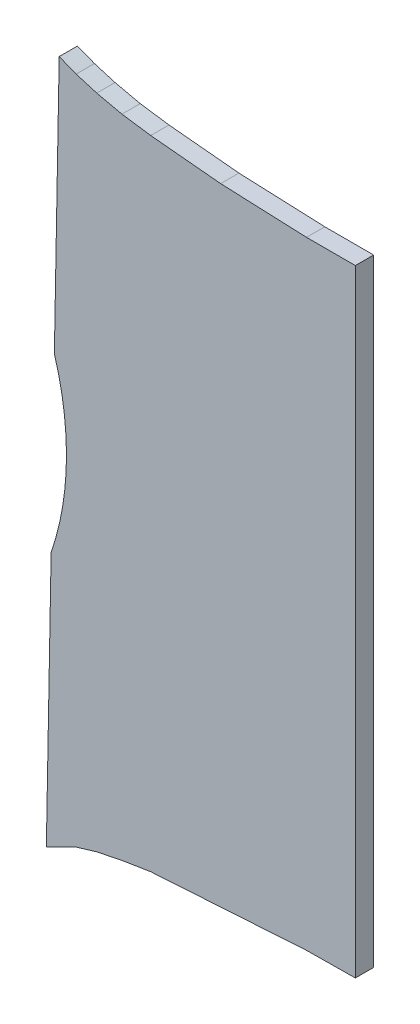
ISO-10303-21;
HEADER;
FILE_DESCRIPTION(('STEP AP214'),'2;1');
FILE_NAME('part.step','',(''),(''),'','','');
FILE_SCHEMA(('AUTOMOTIVE_DESIGN { 1 0 10303 214 1 1 1 1 }'));
ENDSEC;
DATA;
#1=APPLICATION_CONTEXT('core data for automotive mechanical design processes');
#2=APPLICATION_PROTOCOL_DEFINITION('international standard','automotive_design',2000,#1);
#3=PRODUCT_CONTEXT('',#1,'mechanical');
#4=PRODUCT('Part','Part','',(#3));
#5=PRODUCT_RELATED_PRODUCT_CATEGORY('part','',(#4));
#6=PRODUCT_DEFINITION_FORMATION('','',#4);
#7=PRODUCT_DEFINITION_CONTEXT('part definition',#1,'design');
#8=PRODUCT_DEFINITION('design','',#6,#7);
#9=PRODUCT_DEFINITION_SHAPE('','',#8);
#10=(LENGTH_UNIT() NAMED_UNIT(*) SI_UNIT(.MILLI.,.METRE.));
#11=(NAMED_UNIT(*) PLANE_ANGLE_UNIT() SI_UNIT($,.RADIAN.));
#12=(NAMED_UNIT(*) SI_UNIT($,.STERADIAN.) SOLID_ANGLE_UNIT());
#13=UNCERTAINTY_MEASURE_WITH_UNIT(LENGTH_MEASURE(1.E-05),#10,'distance_accuracy_value','');
#14=(GEOMETRIC_REPRESENTATION_CONTEXT(3) GLOBAL_UNCERTAINTY_ASSIGNED_CONTEXT((#13)) GLOBAL_UNIT_ASSIGNED_CONTEXT((#10,
#11,#12)) REPRESENTATION_CONTEXT('',''));
#15=CARTESIAN_POINT('',(0.,0.,0.));
#16=DIRECTION('',(0.,0.,1.));
#17=DIRECTION('',(1.,0.,0.));
#18=AXIS2_PLACEMENT_3D('',#15,#16,#17);
#19=CARTESIAN_POINT('',(97.8160018920898,56.6370010375977,0.));
#20=DIRECTION('',(-1.,0.,0.));
#21=DIRECTION('',(0.,1.,0.));
#22=AXIS2_PLACEMENT_3D('',#19,#20,#21);
#23=PLANE('',#22);
#24=DIRECTION('',(0.,1.,0.));
#25=VECTOR('',#24,1.);
#26=CARTESIAN_POINT('',(97.8160018920898,56.6370010375976,0.03556));
#27=LINE('',#26,#25);
#28=CARTESIAN_POINT('',(97.8160018920898,56.6370010375976,0.03556));
#29=VERTEX_POINT('',#28);
#30=CARTESIAN_POINT('',(97.8160018920898,57.8370018005371,0.03556));
#31=VERTEX_POINT('',#30);
#32=EDGE_CURVE('E11',#29,#31,#27,.T.);
#33=ORIENTED_EDGE('',*,*,#32,.F.);
#34=DIRECTION('',(0.,0.,1.));
#35=VECTOR('',#34,1.);
#36=CARTESIAN_POINT('',(97.8160018920898,56.6370010375976,0.));
#37=LINE('',#36,#35);
#38=CARTESIAN_POINT('',(97.8160018920898,56.6370010375976,0.));
#39=VERTEX_POINT('',#38);
#40=EDGE_CURVE('E24',#39,#29,#37,.T.);
#41=ORIENTED_EDGE('',*,*,#40,.F.);
#42=DIRECTION('',(0.,1.,0.));
#43=VECTOR('',#42,1.);
#44=CARTESIAN_POINT('',(97.8160018920898,56.6370010375976,0.));
#45=LINE('',#44,#43);
#46=CARTESIAN_POINT('',(97.8160018920898,57.8370018005371,0.));
#47=VERTEX_POINT('',#46);
#48=EDGE_CURVE('E281',#39,#47,#45,.T.);
#49=ORIENTED_EDGE('',*,*,#48,.T.);
#50=DIRECTION('',(0.,0.,1.));
#51=VECTOR('',#50,1.);
#52=CARTESIAN_POINT('',(97.8160018920898,57.8370018005371,0.));
#53=LINE('',#52,#51);
#54=EDGE_CURVE('E37',#47,#31,#53,.T.);
#55=ORIENTED_EDGE('',*,*,#54,.T.);
#56=EDGE_LOOP('',(#33,#41,#49,#55));
#57=FACE_BOUND('',#56,.T.);
#58=ADVANCED_FACE('F17',(#57),#23,.F.);
#59=CARTESIAN_POINT('',(97.7210006713867,56.6360015869141,0.));
#60=DIRECTION('',(-0.010519816185477,0.999944665202742,0.));
#61=DIRECTION('',(0.999944665202742,0.010519816185477,0.));
#62=AXIS2_PLACEMENT_3D('',#59,#60,#61);
#63=PLANE('',#62);
#64=DIRECTION('',(0.999944665202742,0.010519816185477,0.));
#65=VECTOR('',#64,1.);
#66=CARTESIAN_POINT('',(97.7210006713867,56.6360015869141,0.03556));
#67=LINE('',#66,#65);
#68=CARTESIAN_POINT('',(97.7210006713867,56.6360015869141,0.03556));
#69=VERTEX_POINT('',#68);
#70=EDGE_CURVE('E277',#69,#29,#67,.T.);
#71=ORIENTED_EDGE('',*,*,#70,.F.);
#72=DIRECTION('',(0.,0.,1.));
#73=VECTOR('',#72,1.);
#74=CARTESIAN_POINT('',(97.7210006713867,56.6360015869141,0.));
#75=LINE('',#74,#73);
#76=CARTESIAN_POINT('',(97.7210006713867,56.6360015869141,0.));
#77=VERTEX_POINT('',#76);
#78=EDGE_CURVE('E275',#77,#69,#75,.T.);
#79=ORIENTED_EDGE('',*,*,#78,.F.);
#80=DIRECTION('',(0.999944665202742,0.010519816185477,0.));
#81=VECTOR('',#80,1.);
#82=CARTESIAN_POINT('',(97.7210006713867,56.6360015869141,0.));
#83=LINE('',#82,#81);
#84=EDGE_CURVE('E273',#77,#39,#83,.T.);
#85=ORIENTED_EDGE('',*,*,#84,.T.);
#86=ORIENTED_EDGE('',*,*,#40,.T.);
#87=EDGE_LOOP('',(#71,#79,#85,#86));
#88=FACE_BOUND('',#87,.T.);
#89=ADVANCED_FACE('F284',(#88),#63,.F.);
#90=CARTESIAN_POINT('',(97.4179992675781,56.617000579834,0.));
#91=DIRECTION('',(-0.0625863654447241,0.998039551751542,0.));
#92=DIRECTION('',(0.998039551751542,0.0625863654447241,0.));
#93=AXIS2_PLACEMENT_3D('',#90,#91,#92);
#94=PLANE('',#93);
#95=DIRECTION('',(0.998039551751542,0.062586365444724,0.));
#96=VECTOR('',#95,1.);
#97=CARTESIAN_POINT('',(97.4179992675781,56.617000579834,0.03556));
#98=LINE('',#97,#96);
#99=CARTESIAN_POINT('',(97.4179992675781,56.617000579834,0.03556));
#100=VERTEX_POINT('',#99);
#101=EDGE_CURVE('E270',#100,#69,#98,.T.);
#102=ORIENTED_EDGE('',*,*,#101,.F.);
#103=DIRECTION('',(0.,0.,1.));
#104=VECTOR('',#103,1.);
#105=CARTESIAN_POINT('',(97.4179992675781,56.617000579834,0.));
#106=LINE('',#105,#104);
#107=CARTESIAN_POINT('',(97.4179992675781,56.617000579834,0.));
#108=VERTEX_POINT('',#107);
#109=EDGE_CURVE('E268',#108,#100,#106,.T.);
#110=ORIENTED_EDGE('',*,*,#109,.F.);
#111=DIRECTION('',(0.998039551751542,0.062586365444724,0.));
#112=VECTOR('',#111,1.);
#113=CARTESIAN_POINT('',(97.4179992675781,56.617000579834,0.));
#114=LINE('',#113,#112);
#115=EDGE_CURVE('E265',#108,#77,#114,.T.);
#116=ORIENTED_EDGE('',*,*,#115,.T.);
#117=ORIENTED_EDGE('',*,*,#78,.T.);
#118=EDGE_LOOP('',(#102,#110,#116,#117));
#119=FACE_BOUND('',#118,.T.);
#120=ADVANCED_FACE('F287',(#119),#94,.F.);
#121=CARTESIAN_POINT('',(97.3619995117188,56.6080017089844,0.));
#122=DIRECTION('',(-0.158659362899509,0.98733338167223,0.));
#123=DIRECTION('',(0.98733338167223,0.158659362899509,0.));
#124=AXIS2_PLACEMENT_3D('',#121,#122,#123);
#125=PLANE('',#124);
#126=DIRECTION('',(0.98733338167223,0.158659362899509,0.));
#127=VECTOR('',#126,1.);
#128=CARTESIAN_POINT('',(97.3619995117188,56.6080017089844,0.03556));
#129=LINE('',#128,#127);
#130=CARTESIAN_POINT('',(97.3619995117188,56.6080017089844,0.03556));
#131=VERTEX_POINT('',#130);
#132=EDGE_CURVE('E262',#131,#100,#129,.T.);
#133=ORIENTED_EDGE('',*,*,#132,.F.);
#134=DIRECTION('',(0.,0.,1.));
#135=VECTOR('',#134,1.);
#136=CARTESIAN_POINT('',(97.3619995117188,56.6080017089844,0.));
#137=LINE('',#136,#135);
#138=CARTESIAN_POINT('',(97.3619995117188,56.6080017089844,0.));
#139=VERTEX_POINT('',#138);
#140=EDGE_CURVE('E260',#139,#131,#137,.T.);
#141=ORIENTED_EDGE('',*,*,#140,.F.);
#142=DIRECTION('',(0.98733338167223,0.158659362899509,0.));
#143=VECTOR('',#142,1.);
#144=CARTESIAN_POINT('',(97.3619995117188,56.6080017089844,0.));
#145=LINE('',#144,#143);
#146=EDGE_CURVE('E257',#139,#108,#145,.T.);
#147=ORIENTED_EDGE('',*,*,#146,.T.);
#148=ORIENTED_EDGE('',*,*,#109,.T.);
#149=EDGE_LOOP('',(#133,#141,#147,#148));
#150=FACE_BOUND('',#149,.T.);
#151=ADVANCED_FACE('F292',(#150),#125,.F.);
#152=CARTESIAN_POINT('',(97.313003540039,56.5979995727539,0.));
#153=DIRECTION('',(-0.200016805310508,0.979792466593502,0.));
#154=DIRECTION('',(0.979792466593502,0.200016805310508,0.));
#155=AXIS2_PLACEMENT_3D('',#152,#153,#154);
#156=PLANE('',#155);
#157=DIRECTION('',(0.979792466593502,0.200016805310508,0.));
#158=VECTOR('',#157,1.);
#159=CARTESIAN_POINT('',(97.313003540039,56.5979995727539,0.03556));
#160=LINE('',#159,#158);
#161=CARTESIAN_POINT('',(97.313003540039,56.5979995727539,0.03556));
#162=VERTEX_POINT('',#161);
#163=EDGE_CURVE('E254',#162,#131,#160,.T.);
#164=ORIENTED_EDGE('',*,*,#163,.F.);
#165=DIRECTION('',(0.,0.,1.));
#166=VECTOR('',#165,1.);
#167=CARTESIAN_POINT('',(97.313003540039,56.5979995727539,0.));
#168=LINE('',#167,#166);
#169=CARTESIAN_POINT('',(97.313003540039,56.5979995727539,0.));
#170=VERTEX_POINT('',#169);
#171=EDGE_CURVE('E252',#170,#162,#168,.T.);
#172=ORIENTED_EDGE('',*,*,#171,.F.);
#173=DIRECTION('',(0.979792466593502,0.200016805310508,0.));
#174=VECTOR('',#173,1.);
#175=CARTESIAN_POINT('',(97.313003540039,56.5979995727539,0.));
#176=LINE('',#175,#174);
#177=EDGE_CURVE('E249',#170,#139,#176,.T.);
#178=ORIENTED_EDGE('',*,*,#177,.T.);
#179=ORIENTED_EDGE('',*,*,#140,.T.);
#180=EDGE_LOOP('',(#164,#172,#178,#179));
#181=FACE_BOUND('',#180,.T.);
#182=ADVANCED_FACE('F295',(#181),#156,.F.);
#183=CARTESIAN_POINT('',(97.2730026245117,56.5859985351562,0.));
#184=DIRECTION('',(-0.287364645680626,0.957821257027034,0.));
#185=DIRECTION('',(0.957821257027034,0.287364645680626,0.));
#186=AXIS2_PLACEMENT_3D('',#183,#184,#185);
#187=PLANE('',#186);
#188=DIRECTION('',(0.957821257027034,0.287364645680626,0.));
#189=VECTOR('',#188,1.);
#190=CARTESIAN_POINT('',(97.2730026245117,56.5859985351562,0.03556));
#191=LINE('',#190,#189);
#192=CARTESIAN_POINT('',(97.2730026245117,56.5859985351562,0.03556));
#193=VERTEX_POINT('',#192);
#194=EDGE_CURVE('E246',#193,#162,#191,.T.);
#195=ORIENTED_EDGE('',*,*,#194,.F.);
#196=DIRECTION('',(0.,0.,1.));
#197=VECTOR('',#196,1.);
#198=CARTESIAN_POINT('',(97.2730026245117,56.5859985351562,0.));
#199=LINE('',#198,#197);
#200=CARTESIAN_POINT('',(97.2730026245117,56.5859985351562,0.));
#201=VERTEX_POINT('',#200);
#202=EDGE_CURVE('E244',#201,#193,#199,.T.);
#203=ORIENTED_EDGE('',*,*,#202,.F.);
#204=DIRECTION('',(0.957821257027034,0.287364645680626,0.));
#205=VECTOR('',#204,1.);
#206=CARTESIAN_POINT('',(97.2730026245117,56.5859985351562,0.));
#207=LINE('',#206,#205);
#208=EDGE_CURVE('E241',#201,#170,#207,.T.);
#209=ORIENTED_EDGE('',*,*,#208,.T.);
#210=ORIENTED_EDGE('',*,*,#171,.T.);
#211=EDGE_LOOP('',(#195,#203,#209,#210));
#212=FACE_BOUND('',#211,.T.);
#213=ADVANCED_FACE('F300',(#212),#187,.F.);
#214=CARTESIAN_POINT('',(97.2149963378906,56.556999206543,0.));
#215=DIRECTION('',(-0.44716653710283,0.894450718651097,0.));
#216=DIRECTION('',(0.894450718651097,0.44716653710283,0.));
#217=AXIS2_PLACEMENT_3D('',#214,#215,#216);
#218=PLANE('',#217);
#219=DIRECTION('',(0.894450718651097,0.44716653710283,0.));
#220=VECTOR('',#219,1.);
#221=CARTESIAN_POINT('',(97.2149963378906,56.556999206543,0.03556));
#222=LINE('',#221,#220);
#223=CARTESIAN_POINT('',(97.2149963378906,56.556999206543,0.03556));
#224=VERTEX_POINT('',#223);
#225=EDGE_CURVE('E238',#224,#193,#222,.T.);
#226=ORIENTED_EDGE('',*,*,#225,.F.);
#227=DIRECTION('',(0.,0.,1.));
#228=VECTOR('',#227,1.);
#229=CARTESIAN_POINT('',(97.2149963378906,56.556999206543,0.));
#230=LINE('',#229,#228);
#231=CARTESIAN_POINT('',(97.2149963378906,56.556999206543,0.));
#232=VERTEX_POINT('',#231);
#233=EDGE_CURVE('E236',#232,#224,#230,.T.);
#234=ORIENTED_EDGE('',*,*,#233,.F.);
#235=DIRECTION('',(0.894450718651097,0.44716653710283,0.));
#236=VECTOR('',#235,1.);
#237=CARTESIAN_POINT('',(97.2149963378906,56.556999206543,0.));
#238=LINE('',#237,#236);
#239=EDGE_CURVE('E233',#232,#201,#238,.T.);
#240=ORIENTED_EDGE('',*,*,#239,.T.);
#241=ORIENTED_EDGE('',*,*,#202,.T.);
#242=EDGE_LOOP('',(#226,#234,#240,#241));
#243=FACE_BOUND('',#242,.T.);
#244=ADVANCED_FACE('F303',(#243),#218,.F.);
#245=CARTESIAN_POINT('',(97.2243158358186,57.0579854972021,0.));
#246=DIRECTION('',(0.999827022085491,-0.0185990835166362,0.));
#247=DIRECTION('',(-0.0185990835166362,-0.999827022085491,0.));
#248=AXIS2_PLACEMENT_3D('',#245,#246,#247);
#249=PLANE('',#248);
#250=DIRECTION('',(-0.0185990835166362,-0.999827022085491,0.));
#251=VECTOR('',#250,1.);
#252=CARTESIAN_POINT('',(97.2399978637695,57.9010009765625,0.03556));
#253=LINE('',#252,#251);
#254=CARTESIAN_POINT('',(97.2243158358186,57.0579854972021,0.03556));
#255=VERTEX_POINT('',#254);
#256=EDGE_CURVE('E230',#255,#224,#253,.T.);
#257=ORIENTED_EDGE('',*,*,#256,.F.);
#258=DIRECTION('',(0.,0.,1.));
#259=VECTOR('',#258,1.);
#260=CARTESIAN_POINT('',(97.2243158358186,57.0579854972021,0.));
#261=LINE('',#260,#259);
#262=CARTESIAN_POINT('',(97.2243158358186,57.0579854972021,0.));
#263=VERTEX_POINT('',#262);
#264=EDGE_CURVE('E228',#263,#255,#261,.T.);
#265=ORIENTED_EDGE('',*,*,#264,.F.);
#266=DIRECTION('',(-0.0185990835166362,-0.999827022085491,0.));
#267=VECTOR('',#266,1.);
#268=CARTESIAN_POINT('',(97.2399978637695,57.9010009765625,0.));
#269=LINE('',#268,#267);
#270=EDGE_CURVE('E225',#263,#232,#269,.T.);
#271=ORIENTED_EDGE('',*,*,#270,.T.);
#272=ORIENTED_EDGE('',*,*,#233,.T.);
#273=EDGE_LOOP('',(#257,#265,#271,#272));
#274=FACE_BOUND('',#273,.T.);
#275=ADVANCED_FACE('F308',(#274),#249,.F.);
#276=CARTESIAN_POINT('',(96.70415,57.2366648,0.));
#277=DIRECTION('',(0.,0.,-1.));
#278=DIRECTION('',(1.,0.,0.));
#279=AXIS2_PLACEMENT_3D('',#276,#277,#278);
#280=CYLINDRICAL_SURFACE('',#279,0.5499989);
#281=ORIENTED_EDGE('',*,*,#264,.T.);
#282=CARTESIAN_POINT('',(96.70415,57.2366648,0.03556));
#283=DIRECTION('',(0.,0.,1.));
#284=DIRECTION('',(1.,0.,0.));
#285=AXIS2_PLACEMENT_3D('',#282,#283,#284);
#286=CIRCLE('',#285,0.5499989);
#287=CARTESIAN_POINT('',(97.2541489,57.2366648,0.03556));
#288=VERTEX_POINT('',#287);
#289=EDGE_CURVE('E222',#255,#288,#286,.T.);
#290=ORIENTED_EDGE('',*,*,#289,.T.);
#291=DIRECTION('',(0.,0.,1.));
#292=VECTOR('',#291,1.);
#293=CARTESIAN_POINT('',(97.2541489,57.2366648,0.));
#294=LINE('',#293,#292);
#295=CARTESIAN_POINT('',(97.2541489,57.2366648,0.));
#296=VERTEX_POINT('',#295);
#297=EDGE_CURVE('E220',#296,#288,#294,.T.);
#298=ORIENTED_EDGE('',*,*,#297,.F.);
#299=CARTESIAN_POINT('',(96.70415,57.2366648,0.));
#300=DIRECTION('',(0.,0.,1.));
#301=DIRECTION('',(1.,0.,0.));
#302=AXIS2_PLACEMENT_3D('',#299,#300,#301);
#303=CIRCLE('',#302,0.5499989);
#304=EDGE_CURVE('E217',#263,#296,#303,.T.);
#305=ORIENTED_EDGE('',*,*,#304,.F.);
#306=EDGE_LOOP('',(#281,#290,#298,#305));
#307=FACE_BOUND('',#306,.T.);
#308=ADVANCED_FACE('F311',(#307),#280,.F.);
#309=CARTESIAN_POINT('',(96.70415,57.2366648,0.));
#310=DIRECTION('',(0.,0.,-1.));
#311=DIRECTION('',(1.,0.,0.));
#312=AXIS2_PLACEMENT_3D('',#309,#310,#311);
#313=CYLINDRICAL_SURFACE('',#312,0.5499989);
#314=ORIENTED_EDGE('',*,*,#297,.T.);
#315=CARTESIAN_POINT('',(96.70415,57.2366648,0.03556));
#316=DIRECTION('',(0.,0.,1.));
#317=DIRECTION('',(1.,0.,0.));
#318=AXIS2_PLACEMENT_3D('',#315,#316,#317);
#319=CIRCLE('',#318,0.5499989);
#320=CARTESIAN_POINT('',(97.2306013509866,57.3958746145391,0.03556));
#321=VERTEX_POINT('',#320);
#322=EDGE_CURVE('E214',#288,#321,#319,.T.);
#323=ORIENTED_EDGE('',*,*,#322,.T.);
#324=DIRECTION('',(0.,0.,1.));
#325=VECTOR('',#324,1.);
#326=CARTESIAN_POINT('',(97.2306013509866,57.3958746145391,0.));
#327=LINE('',#326,#325);
#328=CARTESIAN_POINT('',(97.2306013509866,57.3958746145391,0.));
#329=VERTEX_POINT('',#328);
#330=EDGE_CURVE('E212',#329,#321,#327,.T.);
#331=ORIENTED_EDGE('',*,*,#330,.F.);
#332=EDGE_CURVE('E211',#296,#329,#303,.T.);
#333=ORIENTED_EDGE('',*,*,#332,.F.);
#334=EDGE_LOOP('',(#314,#323,#331,#333));
#335=FACE_BOUND('',#334,.T.);
#336=ADVANCED_FACE('F318',(#335),#313,.F.);
#337=CARTESIAN_POINT('',(97.2399978637695,57.9010009765625,0.));
#338=DIRECTION('',(0.999827022085491,-0.0185990835166362,0.));
#339=DIRECTION('',(-0.0185990835166362,-0.999827022085491,0.));
#340=AXIS2_PLACEMENT_3D('',#337,#338,#339);
#341=PLANE('',#340);
#342=DIRECTION('',(-0.0185990835166362,-0.999827022085491,0.));
#343=VECTOR('',#342,1.);
#344=CARTESIAN_POINT('',(97.2399978637695,57.9010009765625,0.03556));
#345=LINE('',#344,#343);
#346=CARTESIAN_POINT('',(97.2399978637695,57.9010009765625,0.03556));
#347=VERTEX_POINT('',#346);
#348=EDGE_CURVE('E208',#347,#321,#345,.T.);
#349=ORIENTED_EDGE('',*,*,#348,.F.);
#350=DIRECTION('',(0.,0.,1.));
#351=VECTOR('',#350,1.);
#352=CARTESIAN_POINT('',(97.2399978637695,57.9010009765625,0.));
#353=LINE('',#352,#351);
#354=CARTESIAN_POINT('',(97.2399978637695,57.9010009765625,0.));
#355=VERTEX_POINT('',#354);
#356=EDGE_CURVE('E206',#355,#347,#353,.T.);
#357=ORIENTED_EDGE('',*,*,#356,.F.);
#358=EDGE_CURVE('E205',#355,#329,#269,.T.);
#359=ORIENTED_EDGE('',*,*,#358,.T.);
#360=ORIENTED_EDGE('',*,*,#330,.T.);
#361=EDGE_LOOP('',(#349,#357,#359,#360));
#362=FACE_BOUND('',#361,.T.);
#363=ADVANCED_FACE('F321',(#362),#341,.F.);
#364=CARTESIAN_POINT('',(97.2730026245117,57.8880004882812,0.));
#365=DIRECTION('',(-0.366490666642999,-0.930421727639445,0.));
#366=DIRECTION('',(-0.930421727639445,0.366490666642999,0.));
#367=AXIS2_PLACEMENT_3D('',#364,#365,#366);
#368=PLANE('',#367);
#369=DIRECTION('',(-0.930421727639445,0.366490666642999,0.));
#370=VECTOR('',#369,1.);
#371=CARTESIAN_POINT('',(97.2730026245117,57.8880004882812,0.03556));
#372=LINE('',#371,#370);
#373=CARTESIAN_POINT('',(97.2730026245117,57.8880004882812,0.03556));
#374=VERTEX_POINT('',#373);
#375=EDGE_CURVE('E202',#374,#347,#372,.T.);
#376=ORIENTED_EDGE('',*,*,#375,.F.);
#377=DIRECTION('',(0.,0.,1.));
#378=VECTOR('',#377,1.);
#379=CARTESIAN_POINT('',(97.2730026245117,57.8880004882812,0.));
#380=LINE('',#379,#378);
#381=CARTESIAN_POINT('',(97.2730026245117,57.8880004882812,0.));
#382=VERTEX_POINT('',#381);
#383=EDGE_CURVE('E200',#382,#374,#380,.T.);
#384=ORIENTED_EDGE('',*,*,#383,.F.);
#385=DIRECTION('',(-0.930421727639445,0.366490666642999,0.));
#386=VECTOR('',#385,1.);
#387=CARTESIAN_POINT('',(97.2730026245117,57.8880004882812,0.));
#388=LINE('',#387,#386);
#389=EDGE_CURVE('E197',#382,#355,#388,.T.);
#390=ORIENTED_EDGE('',*,*,#389,.T.);
#391=ORIENTED_EDGE('',*,*,#356,.T.);
#392=EDGE_LOOP('',(#376,#384,#390,#391));
#393=FACE_BOUND('',#392,.T.);
#394=ADVANCED_FACE('F326',(#393),#368,.F.);
#395=CARTESIAN_POINT('',(97.313003540039,57.8759994506836,0.));
#396=DIRECTION('',(-0.287364645680626,-0.957821257027034,0.));
#397=DIRECTION('',(-0.957821257027034,0.287364645680626,0.));
#398=AXIS2_PLACEMENT_3D('',#395,#396,#397);
#399=PLANE('',#398);
#400=DIRECTION('',(-0.957821257027034,0.287364645680626,0.));
#401=VECTOR('',#400,1.);
#402=CARTESIAN_POINT('',(97.313003540039,57.8759994506836,0.03556));
#403=LINE('',#402,#401);
#404=CARTESIAN_POINT('',(97.313003540039,57.8759994506836,0.03556));
#405=VERTEX_POINT('',#404);
#406=EDGE_CURVE('E194',#405,#374,#403,.T.);
#407=ORIENTED_EDGE('',*,*,#406,.F.);
#408=DIRECTION('',(0.,0.,1.));
#409=VECTOR('',#408,1.);
#410=CARTESIAN_POINT('',(97.313003540039,57.8759994506836,0.));
#411=LINE('',#410,#409);
#412=CARTESIAN_POINT('',(97.313003540039,57.8759994506836,0.));
#413=VERTEX_POINT('',#412);
#414=EDGE_CURVE('E192',#413,#405,#411,.T.);
#415=ORIENTED_EDGE('',*,*,#414,.F.);
#416=DIRECTION('',(-0.957821257027034,0.287364645680626,0.));
#417=VECTOR('',#416,1.);
#418=CARTESIAN_POINT('',(97.313003540039,57.8759994506836,0.));
#419=LINE('',#418,#417);
#420=EDGE_CURVE('E189',#413,#382,#419,.T.);
#421=ORIENTED_EDGE('',*,*,#420,.T.);
#422=ORIENTED_EDGE('',*,*,#383,.T.);
#423=EDGE_LOOP('',(#407,#415,#421,#422));
#424=FACE_BOUND('',#423,.T.);
#425=ADVANCED_FACE('F329',(#424),#399,.F.);
#426=CARTESIAN_POINT('',(97.3619995117188,57.8650016784668,0.));
#427=DIRECTION('',(-0.219013250789558,-0.975721884544254,0.));
#428=DIRECTION('',(-0.975721884544254,0.219013250789558,0.));
#429=AXIS2_PLACEMENT_3D('',#426,#427,#428);
#430=PLANE('',#429);
#431=DIRECTION('',(-0.975721884544254,0.219013250789558,0.));
#432=VECTOR('',#431,1.);
#433=CARTESIAN_POINT('',(97.3619995117188,57.8650016784668,0.03556));
#434=LINE('',#433,#432);
#435=CARTESIAN_POINT('',(97.3619995117188,57.8650016784668,0.03556));
#436=VERTEX_POINT('',#435);
#437=EDGE_CURVE('E186',#436,#405,#434,.T.);
#438=ORIENTED_EDGE('',*,*,#437,.F.);
#439=DIRECTION('',(0.,0.,1.));
#440=VECTOR('',#439,1.);
#441=CARTESIAN_POINT('',(97.3619995117188,57.8650016784668,0.));
#442=LINE('',#441,#440);
#443=CARTESIAN_POINT('',(97.3619995117188,57.8650016784668,0.));
#444=VERTEX_POINT('',#443);
#445=EDGE_CURVE('E184',#444,#436,#442,.T.);
#446=ORIENTED_EDGE('',*,*,#445,.F.);
#447=DIRECTION('',(-0.975721884544254,0.219013250789558,0.));
#448=VECTOR('',#447,1.);
#449=CARTESIAN_POINT('',(97.3619995117188,57.8650016784668,0.));
#450=LINE('',#449,#448);
#451=EDGE_CURVE('E181',#444,#413,#450,.T.);
#452=ORIENTED_EDGE('',*,*,#451,.T.);
#453=ORIENTED_EDGE('',*,*,#414,.T.);
#454=EDGE_LOOP('',(#438,#446,#452,#453));
#455=FACE_BOUND('',#454,.T.);
#456=ADVANCED_FACE('F333',(#455),#430,.F.);
#457=CARTESIAN_POINT('',(97.4179992675781,57.8569984436035,0.));
#458=DIRECTION('',(-0.141478001154013,-0.98994139987651,0.));
#459=DIRECTION('',(-0.98994139987651,0.141478001154013,0.));
#460=AXIS2_PLACEMENT_3D('',#457,#458,#459);
#461=PLANE('',#460);
#462=DIRECTION('',(-0.98994139987651,0.141478001154013,0.));
#463=VECTOR('',#462,1.);
#464=CARTESIAN_POINT('',(97.4179992675781,57.8569984436035,0.03556));
#465=LINE('',#464,#463);
#466=CARTESIAN_POINT('',(97.4179992675781,57.8569984436035,0.03556));
#467=VERTEX_POINT('',#466);
#468=EDGE_CURVE('E178',#467,#436,#465,.T.);
#469=ORIENTED_EDGE('',*,*,#468,.F.);
#470=DIRECTION('',(0.,0.,1.));
#471=VECTOR('',#470,1.);
#472=CARTESIAN_POINT('',(97.4179992675781,57.8569984436035,0.));
#473=LINE('',#472,#471);
#474=CARTESIAN_POINT('',(97.4179992675781,57.8569984436035,0.));
#475=VERTEX_POINT('',#474);
#476=EDGE_CURVE('E176',#475,#467,#473,.T.);
#477=ORIENTED_EDGE('',*,*,#476,.F.);
#478=DIRECTION('',(-0.98994139987651,0.141478001154013,0.));
#479=VECTOR('',#478,1.);
#480=CARTESIAN_POINT('',(97.4179992675781,57.8569984436035,0.));
#481=LINE('',#480,#479);
#482=EDGE_CURVE('E173',#475,#444,#481,.T.);
#483=ORIENTED_EDGE('',*,*,#482,.T.);
#484=ORIENTED_EDGE('',*,*,#445,.T.);
#485=EDGE_LOOP('',(#469,#477,#483,#484));
#486=FACE_BOUND('',#485,.T.);
#487=ADVANCED_FACE('F336',(#486),#461,.F.);
#488=CARTESIAN_POINT('',(97.5540008544922,57.8440017700195,0.));
#489=DIRECTION('',(-0.095129277619608,-0.995464926825437,0.));
#490=DIRECTION('',(-0.995464926825437,0.095129277619608,0.));
#491=AXIS2_PLACEMENT_3D('',#488,#489,#490);
#492=PLANE('',#491);
#493=DIRECTION('',(-0.995464926825436,0.0951292776196079,0.));
#494=VECTOR('',#493,1.);
#495=CARTESIAN_POINT('',(97.5540008544922,57.8440017700195,0.03556));
#496=LINE('',#495,#494);
#497=CARTESIAN_POINT('',(97.5540008544922,57.8440017700195,0.03556));
#498=VERTEX_POINT('',#497);
#499=EDGE_CURVE('E170',#498,#467,#496,.T.);
#500=ORIENTED_EDGE('',*,*,#499,.F.);
#501=DIRECTION('',(0.,0.,1.));
#502=VECTOR('',#501,1.);
#503=CARTESIAN_POINT('',(97.5540008544922,57.8440017700195,0.));
#504=LINE('',#503,#502);
#505=CARTESIAN_POINT('',(97.5540008544922,57.8440017700195,0.));
#506=VERTEX_POINT('',#505);
#507=EDGE_CURVE('E168',#506,#498,#504,.T.);
#508=ORIENTED_EDGE('',*,*,#507,.F.);
#509=DIRECTION('',(-0.995464926825436,0.0951292776196079,0.));
#510=VECTOR('',#509,1.);
#511=CARTESIAN_POINT('',(97.5540008544922,57.8440017700195,0.));
#512=LINE('',#511,#510);
#513=EDGE_CURVE('E159',#506,#475,#512,.T.);
#514=ORIENTED_EDGE('',*,*,#513,.T.);
#515=ORIENTED_EDGE('',*,*,#476,.T.);
#516=EDGE_LOOP('',(#500,#508,#514,#515));
#517=FACE_BOUND('',#516,.T.);
#518=ADVANCED_FACE('F339',(#517),#492,.F.);
#519=CARTESIAN_POINT('',(97.7210006713867,57.8370018005371,0.));
#520=DIRECTION('',(-0.0418792570717929,-0.999122679067548,0.));
#521=DIRECTION('',(-0.999122679067548,0.0418792570717929,0.));
#522=AXIS2_PLACEMENT_3D('',#519,#520,#521);
#523=PLANE('',#522);
#524=DIRECTION('',(-0.999122679067548,0.0418792570717929,0.));
#525=VECTOR('',#524,1.);
#526=CARTESIAN_POINT('',(97.7210006713867,57.8370018005371,0.03556));
#527=LINE('',#526,#525);
#528=CARTESIAN_POINT('',(97.7210006713867,57.8370018005371,0.03556));
#529=VERTEX_POINT('',#528);
#530=EDGE_CURVE('E145',#529,#498,#527,.T.);
#531=ORIENTED_EDGE('',*,*,#530,.F.);
#532=DIRECTION('',(0.,0.,1.));
#533=VECTOR('',#532,1.);
#534=CARTESIAN_POINT('',(97.7210006713867,57.8370018005371,0.));
#535=LINE('',#534,#533);
#536=CARTESIAN_POINT('',(97.7210006713867,57.8370018005371,0.));
#537=VERTEX_POINT('',#536);
#538=EDGE_CURVE('E140',#537,#529,#535,.T.);
#539=ORIENTED_EDGE('',*,*,#538,.F.);
#540=DIRECTION('',(-0.999122679067548,0.0418792570717929,0.));
#541=VECTOR('',#540,1.);
#542=CARTESIAN_POINT('',(97.7210006713867,57.8370018005371,0.));
#543=LINE('',#542,#541);
#544=EDGE_CURVE('E143',#537,#506,#543,.T.);
#545=ORIENTED_EDGE('',*,*,#544,.T.);
#546=ORIENTED_EDGE('',*,*,#507,.T.);
#547=EDGE_LOOP('',(#531,#539,#545,#546));
#548=FACE_BOUND('',#547,.T.);
#549=ADVANCED_FACE('F142',(#548),#523,.F.);
#550=CARTESIAN_POINT('',(97.8160018920898,57.8370018005371,0.));
#551=DIRECTION('',(0.,-1.,0.));
#552=DIRECTION('',(-1.,0.,0.));
#553=AXIS2_PLACEMENT_3D('',#550,#551,#552);
#554=PLANE('',#553);
#555=DIRECTION('',(-1.,0.,0.));
#556=VECTOR('',#555,1.);
#557=CARTESIAN_POINT('',(97.8160018920898,57.8370018005371,0.03556));
#558=LINE('',#557,#556);
#559=EDGE_CURVE('E160',#31,#529,#558,.T.);
#560=ORIENTED_EDGE('',*,*,#559,.F.);
#561=ORIENTED_EDGE('',*,*,#54,.F.);
#562=DIRECTION('',(-1.,0.,0.));
#563=VECTOR('',#562,1.);
#564=CARTESIAN_POINT('',(97.8160018920898,57.8370018005371,0.));
#565=LINE('',#564,#563);
#566=EDGE_CURVE('E156',#47,#537,#565,.T.);
#567=ORIENTED_EDGE('',*,*,#566,.T.);
#568=ORIENTED_EDGE('',*,*,#538,.T.);
#569=EDGE_LOOP('',(#560,#561,#567,#568));
#570=FACE_BOUND('',#569,.T.);
#571=ADVANCED_FACE('F162',(#570),#554,.F.);
#572=CARTESIAN_POINT('',(97.8160018920898,57.8370018005371,0.));
#573=DIRECTION('',(0.,0.,1.));
#574=DIRECTION('',(1.,0.,0.));
#575=AXIS2_PLACEMENT_3D('',#572,#573,#574);
#576=PLANE('',#575);
#577=ORIENTED_EDGE('',*,*,#566,.F.);
#578=ORIENTED_EDGE('',*,*,#48,.F.);
#579=ORIENTED_EDGE('',*,*,#84,.F.);
#580=ORIENTED_EDGE('',*,*,#115,.F.);
#581=ORIENTED_EDGE('',*,*,#146,.F.);
#582=ORIENTED_EDGE('',*,*,#177,.F.);
#583=ORIENTED_EDGE('',*,*,#208,.F.);
#584=ORIENTED_EDGE('',*,*,#239,.F.);
#585=ORIENTED_EDGE('',*,*,#270,.F.);
#586=ORIENTED_EDGE('',*,*,#304,.T.);
#587=ORIENTED_EDGE('',*,*,#332,.T.);
#588=ORIENTED_EDGE('',*,*,#358,.F.);
#589=ORIENTED_EDGE('',*,*,#389,.F.);
#590=ORIENTED_EDGE('',*,*,#420,.F.);
#591=ORIENTED_EDGE('',*,*,#451,.F.);
#592=ORIENTED_EDGE('',*,*,#482,.F.);
#593=ORIENTED_EDGE('',*,*,#513,.F.);
#594=ORIENTED_EDGE('',*,*,#544,.F.);
#595=EDGE_LOOP('',(#577,#578,#579,#580,#581,#582,#583,#584,#585,#586,#587,#588,#589,#590,#591,
#592,#593,#594));
#596=FACE_BOUND('',#595,.T.);
#597=ADVANCED_FACE('F154',(#596),#576,.F.);
#598=CARTESIAN_POINT('',(97.8160018920898,57.8370018005371,0.03556));
#599=DIRECTION('',(0.,0.,1.));
#600=DIRECTION('',(1.,0.,0.));
#601=AXIS2_PLACEMENT_3D('',#598,#599,#600);
#602=PLANE('',#601);
#603=ORIENTED_EDGE('',*,*,#32,.T.);
#604=ORIENTED_EDGE('',*,*,#559,.T.);
#605=ORIENTED_EDGE('',*,*,#530,.T.);
#606=ORIENTED_EDGE('',*,*,#499,.T.);
#607=ORIENTED_EDGE('',*,*,#468,.T.);
#608=ORIENTED_EDGE('',*,*,#437,.T.);
#609=ORIENTED_EDGE('',*,*,#406,.T.);
#610=ORIENTED_EDGE('',*,*,#375,.T.);
#611=ORIENTED_EDGE('',*,*,#348,.T.);
#612=ORIENTED_EDGE('',*,*,#322,.F.);
#613=ORIENTED_EDGE('',*,*,#289,.F.);
#614=ORIENTED_EDGE('',*,*,#256,.T.);
#615=ORIENTED_EDGE('',*,*,#225,.T.);
#616=ORIENTED_EDGE('',*,*,#194,.T.);
#617=ORIENTED_EDGE('',*,*,#163,.T.);
#618=ORIENTED_EDGE('',*,*,#132,.T.);
#619=ORIENTED_EDGE('',*,*,#101,.T.);
#620=ORIENTED_EDGE('',*,*,#70,.T.);
#621=EDGE_LOOP('',(#603,#604,#605,#606,#607,#608,#609,#610,#611,#612,#613,#614,#615,#616,#617,
#618,#619,#620));
#622=FACE_BOUND('',#621,.T.);
#623=ADVANCED_FACE('F341',(#622),#602,.T.);
#624=CLOSED_SHELL('',(#58,#89,#120,#151,#182,#213,#244,#275,#308,#336,#363,#394,#425,#456,#487,
#518,#549,#571,#597,#623));
#625=MANIFOLD_SOLID_BREP('B1',#624);
#626=ADVANCED_BREP_SHAPE_REPRESENTATION('',(#18,#625),#14);
#627=SHAPE_DEFINITION_REPRESENTATION(#9,#626);
ENDSEC;
END-ISO-10303-21;
